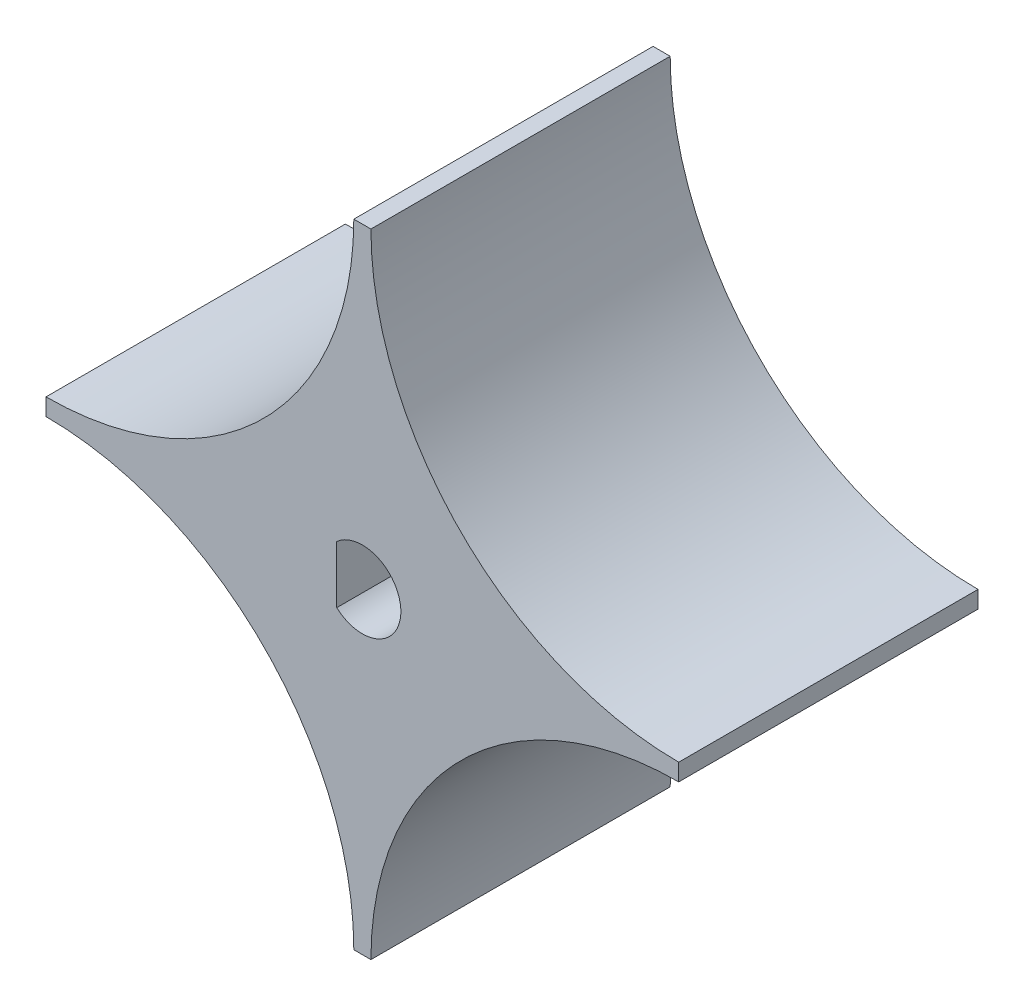
ISO-10303-21;
HEADER;
FILE_DESCRIPTION(('STEP AP214'),'2;1');
FILE_NAME('part.step','',(''),(''),'','','');
FILE_SCHEMA(('AUTOMOTIVE_DESIGN { 1 0 10303 214 1 1 1 1 }'));
ENDSEC;
DATA;
#1=APPLICATION_CONTEXT('core data for automotive mechanical design processes');
#2=APPLICATION_PROTOCOL_DEFINITION('international standard','automotive_design',2000,#1);
#3=PRODUCT_CONTEXT('',#1,'mechanical');
#4=PRODUCT('Part','Part','',(#3));
#5=PRODUCT_RELATED_PRODUCT_CATEGORY('part','',(#4));
#6=PRODUCT_DEFINITION_FORMATION('','',#4);
#7=PRODUCT_DEFINITION_CONTEXT('part definition',#1,'design');
#8=PRODUCT_DEFINITION('design','',#6,#7);
#9=PRODUCT_DEFINITION_SHAPE('','',#8);
#10=(LENGTH_UNIT() NAMED_UNIT(*) SI_UNIT(.MILLI.,.METRE.));
#11=(NAMED_UNIT(*) PLANE_ANGLE_UNIT() SI_UNIT($,.RADIAN.));
#12=(NAMED_UNIT(*) SI_UNIT($,.STERADIAN.) SOLID_ANGLE_UNIT());
#13=UNCERTAINTY_MEASURE_WITH_UNIT(LENGTH_MEASURE(1.E-05),#10,'distance_accuracy_value','');
#14=(GEOMETRIC_REPRESENTATION_CONTEXT(3) GLOBAL_UNCERTAINTY_ASSIGNED_CONTEXT((#13)) GLOBAL_UNIT_ASSIGNED_CONTEXT((#10,
#11,#12)) REPRESENTATION_CONTEXT('',''));
#15=CARTESIAN_POINT('',(0.,0.,0.));
#16=DIRECTION('',(0.,0.,1.));
#17=DIRECTION('',(1.,0.,0.));
#18=AXIS2_PLACEMENT_3D('',#15,#16,#17);
#19=CARTESIAN_POINT('',(-37.,37.,35.));
#20=DIRECTION('',(0.,0.,1.));
#21=DIRECTION('',(1.,0.,0.));
#22=AXIS2_PLACEMENT_3D('',#19,#20,#21);
#23=PLANE('',#22);
#24=CARTESIAN_POINT('',(-37.,37.,35.));
#25=DIRECTION('',(0.,0.,-1.));
#26=DIRECTION('',(1.,0.,0.));
#27=AXIS2_PLACEMENT_3D('',#24,#25,#26);
#28=CIRCLE('',#27,36.);
#29=CARTESIAN_POINT('',(-1.,37.,35.));
#30=VERTEX_POINT('',#29);
#31=CARTESIAN_POINT('',(-37.,0.999999999999995,35.));
#32=VERTEX_POINT('',#31);
#33=EDGE_CURVE('E126',#30,#32,#28,.T.);
#34=ORIENTED_EDGE('',*,*,#33,.T.);
#35=DIRECTION('',(0.,-1.,0.));
#36=VECTOR('',#35,1.);
#37=CARTESIAN_POINT('',(-37.,-1.,35.));
#38=LINE('',#37,#36);
#39=CARTESIAN_POINT('',(-37.,-1.,35.));
#40=VERTEX_POINT('',#39);
#41=EDGE_CURVE('E129',#32,#40,#38,.T.);
#42=ORIENTED_EDGE('',*,*,#41,.T.);
#43=CARTESIAN_POINT('',(-37.,-37.,35.));
#44=DIRECTION('',(0.,0.,-1.));
#45=DIRECTION('',(1.,0.,0.));
#46=AXIS2_PLACEMENT_3D('',#43,#44,#45);
#47=CIRCLE('',#46,36.);
#48=CARTESIAN_POINT('',(-1.,-37.,35.));
#49=VERTEX_POINT('',#48);
#50=EDGE_CURVE('E132',#40,#49,#47,.T.);
#51=ORIENTED_EDGE('',*,*,#50,.T.);
#52=DIRECTION('',(1.,0.,0.));
#53=VECTOR('',#52,1.);
#54=CARTESIAN_POINT('',(-0.999999999999995,-37.,35.));
#55=LINE('',#54,#53);
#56=CARTESIAN_POINT('',(1.,-37.,35.));
#57=VERTEX_POINT('',#56);
#58=EDGE_CURVE('E134',#49,#57,#55,.T.);
#59=ORIENTED_EDGE('',*,*,#58,.T.);
#60=CARTESIAN_POINT('',(37.,-37.,35.));
#61=DIRECTION('',(0.,0.,-1.));
#62=DIRECTION('',(1.,0.,0.));
#63=AXIS2_PLACEMENT_3D('',#60,#61,#62);
#64=CIRCLE('',#63,36.);
#65=CARTESIAN_POINT('',(37.,-1.,35.));
#66=VERTEX_POINT('',#65);
#67=EDGE_CURVE('E136',#57,#66,#64,.T.);
#68=ORIENTED_EDGE('',*,*,#67,.T.);
#69=DIRECTION('',(0.,1.,0.));
#70=VECTOR('',#69,1.);
#71=CARTESIAN_POINT('',(37.,-1.,35.));
#72=LINE('',#71,#70);
#73=CARTESIAN_POINT('',(37.,1.,35.));
#74=VERTEX_POINT('',#73);
#75=EDGE_CURVE('E138',#66,#74,#72,.T.);
#76=ORIENTED_EDGE('',*,*,#75,.T.);
#77=CARTESIAN_POINT('',(37.,37.,35.));
#78=DIRECTION('',(0.,0.,-1.));
#79=DIRECTION('',(1.,0.,0.));
#80=AXIS2_PLACEMENT_3D('',#77,#78,#79);
#81=CIRCLE('',#80,36.);
#82=CARTESIAN_POINT('',(0.999999999999994,37.,35.));
#83=VERTEX_POINT('',#82);
#84=EDGE_CURVE('E140',#74,#83,#81,.T.);
#85=ORIENTED_EDGE('',*,*,#84,.T.);
#86=DIRECTION('',(-1.,0.,0.));
#87=VECTOR('',#86,1.);
#88=CARTESIAN_POINT('',(-1.,37.,35.));
#89=LINE('',#88,#87);
#90=EDGE_CURVE('E142',#83,#30,#89,.T.);
#91=ORIENTED_EDGE('',*,*,#90,.T.);
#92=EDGE_LOOP('',(#34,#42,#51,#59,#68,#76,#85,#91));
#93=FACE_BOUND('',#92,.T.);
#94=DIRECTION('',(0.,-1.,0.));
#95=VECTOR('',#94,1.);
#96=CARTESIAN_POINT('',(-3.,3.35410196624968,35.));
#97=LINE('',#96,#95);
#98=CARTESIAN_POINT('',(-3.,3.35410196624968,35.));
#99=VERTEX_POINT('',#98);
#100=CARTESIAN_POINT('',(-3.,-3.35410196624968,35.));
#101=VERTEX_POINT('',#100);
#102=EDGE_CURVE('E109',#99,#101,#97,.T.);
#103=ORIENTED_EDGE('',*,*,#102,.F.);
#104=CARTESIAN_POINT('',(0.,0.,35.));
#105=DIRECTION('',(0.,0.,1.));
#106=DIRECTION('',(1.,0.,0.));
#107=AXIS2_PLACEMENT_3D('',#104,#105,#106);
#108=CIRCLE('',#107,4.5);
#109=EDGE_CURVE('E115',#101,#99,#108,.T.);
#110=ORIENTED_EDGE('',*,*,#109,.F.);
#111=EDGE_LOOP('',(#103,#110));
#112=FACE_BOUND('',#111,.T.);
#113=ADVANCED_FACE('F33',(#93,#112),#23,.T.);
#114=CARTESIAN_POINT('',(-37.,37.,0.));
#115=DIRECTION('',(0.,0.,1.));
#116=DIRECTION('',(1.,0.,0.));
#117=AXIS2_PLACEMENT_3D('',#114,#115,#116);
#118=PLANE('',#117);
#119=CARTESIAN_POINT('',(-37.,37.,0.));
#120=DIRECTION('',(0.,0.,-1.));
#121=DIRECTION('',(1.,0.,0.));
#122=AXIS2_PLACEMENT_3D('',#119,#120,#121);
#123=CIRCLE('',#122,36.);
#124=CARTESIAN_POINT('',(-1.,37.,0.));
#125=VERTEX_POINT('',#124);
#126=CARTESIAN_POINT('',(-37.,0.999999999999995,0.));
#127=VERTEX_POINT('',#126);
#128=EDGE_CURVE('E125',#125,#127,#123,.T.);
#129=ORIENTED_EDGE('',*,*,#128,.F.);
#130=DIRECTION('',(-1.,0.,0.));
#131=VECTOR('',#130,1.);
#132=CARTESIAN_POINT('',(-1.,37.,0.));
#133=LINE('',#132,#131);
#134=CARTESIAN_POINT('',(0.999999999999994,37.,0.));
#135=VERTEX_POINT('',#134);
#136=EDGE_CURVE('E130',#135,#125,#133,.T.);
#137=ORIENTED_EDGE('',*,*,#136,.F.);
#138=CARTESIAN_POINT('',(37.,37.,0.));
#139=DIRECTION('',(0.,0.,-1.));
#140=DIRECTION('',(1.,0.,0.));
#141=AXIS2_PLACEMENT_3D('',#138,#139,#140);
#142=CIRCLE('',#141,36.);
#143=CARTESIAN_POINT('',(37.,1.,0.));
#144=VERTEX_POINT('',#143);
#145=EDGE_CURVE('E157',#144,#135,#142,.T.);
#146=ORIENTED_EDGE('',*,*,#145,.F.);
#147=DIRECTION('',(0.,1.,0.));
#148=VECTOR('',#147,1.);
#149=CARTESIAN_POINT('',(37.,-1.,0.));
#150=LINE('',#149,#148);
#151=CARTESIAN_POINT('',(37.,-1.,0.));
#152=VERTEX_POINT('',#151);
#153=EDGE_CURVE('E155',#152,#144,#150,.T.);
#154=ORIENTED_EDGE('',*,*,#153,.F.);
#155=CARTESIAN_POINT('',(37.,-37.,0.));
#156=DIRECTION('',(0.,0.,-1.));
#157=DIRECTION('',(1.,0.,0.));
#158=AXIS2_PLACEMENT_3D('',#155,#156,#157);
#159=CIRCLE('',#158,36.);
#160=CARTESIAN_POINT('',(1.,-37.,0.));
#161=VERTEX_POINT('',#160);
#162=EDGE_CURVE('E153',#161,#152,#159,.T.);
#163=ORIENTED_EDGE('',*,*,#162,.F.);
#164=DIRECTION('',(1.,0.,0.));
#165=VECTOR('',#164,1.);
#166=CARTESIAN_POINT('',(-0.999999999999995,-37.,0.));
#167=LINE('',#166,#165);
#168=CARTESIAN_POINT('',(-1.,-37.,0.));
#169=VERTEX_POINT('',#168);
#170=EDGE_CURVE('E151',#169,#161,#167,.T.);
#171=ORIENTED_EDGE('',*,*,#170,.F.);
#172=CARTESIAN_POINT('',(-37.,-37.,0.));
#173=DIRECTION('',(0.,0.,-1.));
#174=DIRECTION('',(1.,0.,0.));
#175=AXIS2_PLACEMENT_3D('',#172,#173,#174);
#176=CIRCLE('',#175,36.);
#177=CARTESIAN_POINT('',(-37.,-1.,0.));
#178=VERTEX_POINT('',#177);
#179=EDGE_CURVE('E149',#178,#169,#176,.T.);
#180=ORIENTED_EDGE('',*,*,#179,.F.);
#181=DIRECTION('',(0.,-1.,0.));
#182=VECTOR('',#181,1.);
#183=CARTESIAN_POINT('',(-37.,-1.,0.));
#184=LINE('',#183,#182);
#185=EDGE_CURVE('E147',#127,#178,#184,.T.);
#186=ORIENTED_EDGE('',*,*,#185,.F.);
#187=EDGE_LOOP('',(#129,#137,#146,#154,#163,#171,#180,#186));
#188=FACE_BOUND('',#187,.T.);
#189=CARTESIAN_POINT('',(0.,0.,0.));
#190=DIRECTION('',(0.,0.,1.));
#191=DIRECTION('',(1.,0.,0.));
#192=AXIS2_PLACEMENT_3D('',#189,#190,#191);
#193=CIRCLE('',#192,4.5);
#194=CARTESIAN_POINT('',(-3.,-3.35410196624968,0.));
#195=VERTEX_POINT('',#194);
#196=CARTESIAN_POINT('',(-3.,3.35410196624968,0.));
#197=VERTEX_POINT('',#196);
#198=EDGE_CURVE('E55',#195,#197,#193,.T.);
#199=ORIENTED_EDGE('',*,*,#198,.T.);
#200=DIRECTION('',(0.,-1.,0.));
#201=VECTOR('',#200,1.);
#202=CARTESIAN_POINT('',(-3.,3.35410196624968,0.));
#203=LINE('',#202,#201);
#204=EDGE_CURVE('E119',#197,#195,#203,.T.);
#205=ORIENTED_EDGE('',*,*,#204,.T.);
#206=EDGE_LOOP('',(#199,#205));
#207=FACE_BOUND('',#206,.T.);
#208=ADVANCED_FACE('F187',(#188,#207),#118,.F.);
#209=CARTESIAN_POINT('',(-37.,37.,35.));
#210=DIRECTION('',(0.,0.,-1.));
#211=DIRECTION('',(-1.,0.,0.));
#212=AXIS2_PLACEMENT_3D('',#209,#210,#211);
#213=CYLINDRICAL_SURFACE('',#212,36.);
#214=ORIENTED_EDGE('',*,*,#128,.T.);
#215=DIRECTION('',(0.,0.,-1.));
#216=VECTOR('',#215,1.);
#217=CARTESIAN_POINT('',(-37.,0.999999999999995,35.));
#218=LINE('',#217,#216);
#219=EDGE_CURVE('E11',#32,#127,#218,.T.);
#220=ORIENTED_EDGE('',*,*,#219,.F.);
#221=ORIENTED_EDGE('',*,*,#33,.F.);
#222=DIRECTION('',(0.,0.,-1.));
#223=VECTOR('',#222,1.);
#224=CARTESIAN_POINT('',(-1.,37.,35.));
#225=LINE('',#224,#223);
#226=EDGE_CURVE('E144',#30,#125,#225,.T.);
#227=ORIENTED_EDGE('',*,*,#226,.T.);
#228=EDGE_LOOP('',(#214,#220,#221,#227));
#229=FACE_BOUND('',#228,.T.);
#230=ADVANCED_FACE('F35',(#229),#213,.F.);
#231=CARTESIAN_POINT('',(-37.,-1.,35.));
#232=DIRECTION('',(1.,0.,0.));
#233=DIRECTION('',(0.,0.,-1.));
#234=AXIS2_PLACEMENT_3D('',#231,#232,#233);
#235=PLANE('',#234);
#236=ORIENTED_EDGE('',*,*,#185,.T.);
#237=DIRECTION('',(0.,0.,-1.));
#238=VECTOR('',#237,1.);
#239=CARTESIAN_POINT('',(-37.,-1.,35.));
#240=LINE('',#239,#238);
#241=EDGE_CURVE('E41',#40,#178,#240,.T.);
#242=ORIENTED_EDGE('',*,*,#241,.F.);
#243=ORIENTED_EDGE('',*,*,#41,.F.);
#244=ORIENTED_EDGE('',*,*,#219,.T.);
#245=EDGE_LOOP('',(#236,#242,#243,#244));
#246=FACE_BOUND('',#245,.T.);
#247=ADVANCED_FACE('F204',(#246),#235,.F.);
#248=CARTESIAN_POINT('',(-37.,-37.,35.));
#249=DIRECTION('',(0.,0.,-1.));
#250=DIRECTION('',(-1.,0.,0.));
#251=AXIS2_PLACEMENT_3D('',#248,#249,#250);
#252=CYLINDRICAL_SURFACE('',#251,36.);
#253=ORIENTED_EDGE('',*,*,#179,.T.);
#254=DIRECTION('',(0.,0.,-1.));
#255=VECTOR('',#254,1.);
#256=CARTESIAN_POINT('',(-1.,-37.,35.));
#257=LINE('',#256,#255);
#258=EDGE_CURVE('E174',#49,#169,#257,.T.);
#259=ORIENTED_EDGE('',*,*,#258,.F.);
#260=ORIENTED_EDGE('',*,*,#50,.F.);
#261=ORIENTED_EDGE('',*,*,#241,.T.);
#262=EDGE_LOOP('',(#253,#259,#260,#261));
#263=FACE_BOUND('',#262,.T.);
#264=ADVANCED_FACE('F181',(#263),#252,.F.);
#265=CARTESIAN_POINT('',(-0.999999999999995,-37.,35.));
#266=DIRECTION('',(0.,1.,0.));
#267=DIRECTION('',(0.,0.,1.));
#268=AXIS2_PLACEMENT_3D('',#265,#266,#267);
#269=PLANE('',#268);
#270=ORIENTED_EDGE('',*,*,#170,.T.);
#271=DIRECTION('',(0.,0.,-1.));
#272=VECTOR('',#271,1.);
#273=CARTESIAN_POINT('',(1.,-37.,35.));
#274=LINE('',#273,#272);
#275=EDGE_CURVE('E171',#57,#161,#274,.T.);
#276=ORIENTED_EDGE('',*,*,#275,.F.);
#277=ORIENTED_EDGE('',*,*,#58,.F.);
#278=ORIENTED_EDGE('',*,*,#258,.T.);
#279=EDGE_LOOP('',(#270,#276,#277,#278));
#280=FACE_BOUND('',#279,.T.);
#281=ADVANCED_FACE('F193',(#280),#269,.F.);
#282=CARTESIAN_POINT('',(37.,-37.,35.));
#283=DIRECTION('',(0.,0.,-1.));
#284=DIRECTION('',(-1.,0.,0.));
#285=AXIS2_PLACEMENT_3D('',#282,#283,#284);
#286=CYLINDRICAL_SURFACE('',#285,36.);
#287=ORIENTED_EDGE('',*,*,#162,.T.);
#288=DIRECTION('',(0.,0.,-1.));
#289=VECTOR('',#288,1.);
#290=CARTESIAN_POINT('',(37.,-1.,35.));
#291=LINE('',#290,#289);
#292=EDGE_CURVE('E168',#66,#152,#291,.T.);
#293=ORIENTED_EDGE('',*,*,#292,.F.);
#294=ORIENTED_EDGE('',*,*,#67,.F.);
#295=ORIENTED_EDGE('',*,*,#275,.T.);
#296=EDGE_LOOP('',(#287,#293,#294,#295));
#297=FACE_BOUND('',#296,.T.);
#298=ADVANCED_FACE('F197',(#297),#286,.F.);
#299=CARTESIAN_POINT('',(37.,-1.,35.));
#300=DIRECTION('',(-1.,0.,0.));
#301=DIRECTION('',(0.,0.,1.));
#302=AXIS2_PLACEMENT_3D('',#299,#300,#301);
#303=PLANE('',#302);
#304=ORIENTED_EDGE('',*,*,#153,.T.);
#305=DIRECTION('',(0.,0.,-1.));
#306=VECTOR('',#305,1.);
#307=CARTESIAN_POINT('',(37.,1.,35.));
#308=LINE('',#307,#306);
#309=EDGE_CURVE('E165',#74,#144,#308,.T.);
#310=ORIENTED_EDGE('',*,*,#309,.F.);
#311=ORIENTED_EDGE('',*,*,#75,.F.);
#312=ORIENTED_EDGE('',*,*,#292,.T.);
#313=EDGE_LOOP('',(#304,#310,#311,#312));
#314=FACE_BOUND('',#313,.T.);
#315=ADVANCED_FACE('F217',(#314),#303,.F.);
#316=CARTESIAN_POINT('',(37.,37.,35.));
#317=DIRECTION('',(0.,0.,-1.));
#318=DIRECTION('',(-1.,0.,0.));
#319=AXIS2_PLACEMENT_3D('',#316,#317,#318);
#320=CYLINDRICAL_SURFACE('',#319,36.);
#321=ORIENTED_EDGE('',*,*,#145,.T.);
#322=DIRECTION('',(0.,0.,-1.));
#323=VECTOR('',#322,1.);
#324=CARTESIAN_POINT('',(0.999999999999994,37.,35.));
#325=LINE('',#324,#323);
#326=EDGE_CURVE('E162',#83,#135,#325,.T.);
#327=ORIENTED_EDGE('',*,*,#326,.F.);
#328=ORIENTED_EDGE('',*,*,#84,.F.);
#329=ORIENTED_EDGE('',*,*,#309,.T.);
#330=EDGE_LOOP('',(#321,#327,#328,#329));
#331=FACE_BOUND('',#330,.T.);
#332=ADVANCED_FACE('F215',(#331),#320,.F.);
#333=CARTESIAN_POINT('',(-1.,37.,35.));
#334=DIRECTION('',(0.,-1.,0.));
#335=DIRECTION('',(0.,0.,-1.));
#336=AXIS2_PLACEMENT_3D('',#333,#334,#335);
#337=PLANE('',#336);
#338=ORIENTED_EDGE('',*,*,#136,.T.);
#339=ORIENTED_EDGE('',*,*,#226,.F.);
#340=ORIENTED_EDGE('',*,*,#90,.F.);
#341=ORIENTED_EDGE('',*,*,#326,.T.);
#342=EDGE_LOOP('',(#338,#339,#340,#341));
#343=FACE_BOUND('',#342,.T.);
#344=ADVANCED_FACE('F210',(#343),#337,.F.);
#345=CARTESIAN_POINT('',(0.,0.,35.));
#346=DIRECTION('',(0.,0.,-1.));
#347=DIRECTION('',(-1.,0.,0.));
#348=AXIS2_PLACEMENT_3D('',#345,#346,#347);
#349=CYLINDRICAL_SURFACE('',#348,4.5);
#350=ORIENTED_EDGE('',*,*,#198,.F.);
#351=DIRECTION('',(0.,0.,-1.));
#352=VECTOR('',#351,1.);
#353=CARTESIAN_POINT('',(-3.,-3.35410196624968,35.));
#354=LINE('',#353,#352);
#355=EDGE_CURVE('E111',#101,#195,#354,.T.);
#356=ORIENTED_EDGE('',*,*,#355,.F.);
#357=ORIENTED_EDGE('',*,*,#109,.T.);
#358=DIRECTION('',(0.,0.,-1.));
#359=VECTOR('',#358,1.);
#360=CARTESIAN_POINT('',(-3.,3.35410196624968,35.));
#361=LINE('',#360,#359);
#362=EDGE_CURVE('E48',#99,#197,#361,.T.);
#363=ORIENTED_EDGE('',*,*,#362,.T.);
#364=EDGE_LOOP('',(#350,#356,#357,#363));
#365=FACE_BOUND('',#364,.T.);
#366=ADVANCED_FACE('F117',(#365),#349,.F.);
#367=CARTESIAN_POINT('',(-3.,3.35410196624968,35.));
#368=DIRECTION('',(1.,0.,0.));
#369=DIRECTION('',(0.,0.,-1.));
#370=AXIS2_PLACEMENT_3D('',#367,#368,#369);
#371=PLANE('',#370);
#372=ORIENTED_EDGE('',*,*,#204,.F.);
#373=ORIENTED_EDGE('',*,*,#362,.F.);
#374=ORIENTED_EDGE('',*,*,#102,.T.);
#375=ORIENTED_EDGE('',*,*,#355,.T.);
#376=EDGE_LOOP('',(#372,#373,#374,#375));
#377=FACE_BOUND('',#376,.T.);
#378=ADVANCED_FACE('F110',(#377),#371,.T.);
#379=CLOSED_SHELL('',(#113,#208,#230,#247,#264,#281,#298,#315,#332,#344,#366,#378));
#380=MANIFOLD_SOLID_BREP('B2',#379);
#381=ADVANCED_BREP_SHAPE_REPRESENTATION('',(#18,#380),#14);
#382=SHAPE_DEFINITION_REPRESENTATION(#9,#381);
ENDSEC;
END-ISO-10303-21;
